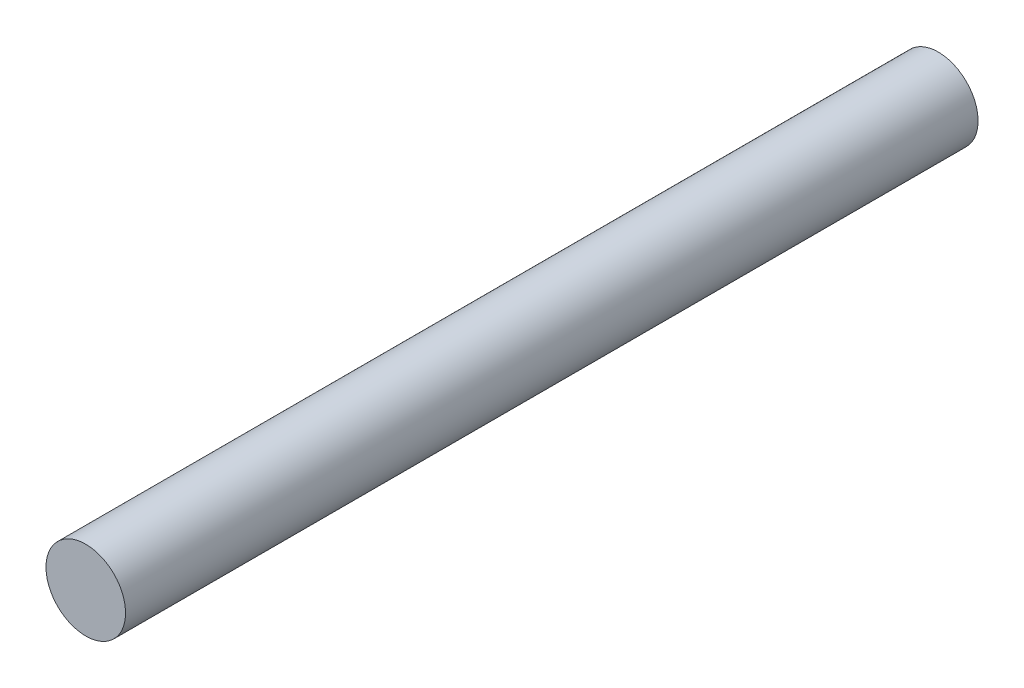
ISO-10303-21;
HEADER;
FILE_DESCRIPTION(('STEP AP214'),'2;1');
FILE_NAME('part.step','',(''),(''),'','','');
FILE_SCHEMA(('AUTOMOTIVE_DESIGN { 1 0 10303 214 1 1 1 1 }'));
ENDSEC;
DATA;
#1=APPLICATION_CONTEXT('core data for automotive mechanical design processes');
#2=APPLICATION_PROTOCOL_DEFINITION('international standard','automotive_design',2000,#1);
#3=PRODUCT_CONTEXT('',#1,'mechanical');
#4=PRODUCT('Part','Part','',(#3));
#5=PRODUCT_RELATED_PRODUCT_CATEGORY('part','',(#4));
#6=PRODUCT_DEFINITION_FORMATION('','',#4);
#7=PRODUCT_DEFINITION_CONTEXT('part definition',#1,'design');
#8=PRODUCT_DEFINITION('design','',#6,#7);
#9=PRODUCT_DEFINITION_SHAPE('','',#8);
#10=(LENGTH_UNIT() NAMED_UNIT(*) SI_UNIT(.MILLI.,.METRE.));
#11=(NAMED_UNIT(*) PLANE_ANGLE_UNIT() SI_UNIT($,.RADIAN.));
#12=(NAMED_UNIT(*) SI_UNIT($,.STERADIAN.) SOLID_ANGLE_UNIT());
#13=UNCERTAINTY_MEASURE_WITH_UNIT(LENGTH_MEASURE(1.E-05),#10,'distance_accuracy_value','');
#14=(GEOMETRIC_REPRESENTATION_CONTEXT(3) GLOBAL_UNCERTAINTY_ASSIGNED_CONTEXT((#13)) GLOBAL_UNIT_ASSIGNED_CONTEXT((#10,
#11,#12)) REPRESENTATION_CONTEXT('',''));
#15=CARTESIAN_POINT('',(0.,0.,0.));
#16=DIRECTION('',(0.,0.,1.));
#17=DIRECTION('',(1.,0.,0.));
#18=AXIS2_PLACEMENT_3D('',#15,#16,#17);
#19=CARTESIAN_POINT('',(0.,0.,38.1));
#20=DIRECTION('',(0.,0.,-1.));
#21=DIRECTION('',(-1.,0.,0.));
#22=AXIS2_PLACEMENT_3D('',#19,#20,#21);
#23=CYLINDRICAL_SURFACE('',#22,1.778);
#24=CARTESIAN_POINT('',(0.,0.,38.1));
#25=DIRECTION('',(0.,0.,1.));
#26=DIRECTION('',(1.,0.,0.));
#27=AXIS2_PLACEMENT_3D('',#24,#25,#26);
#28=CIRCLE('',#27,1.778);
#29=CARTESIAN_POINT('',(-1.778,0.,38.1));
#30=VERTEX_POINT('',#29);
#31=EDGE_CURVE('E10',#30,#30,#28,.T.);
#32=CARTESIAN_POINT('',(0.,0.,0.));
#33=DIRECTION('',(0.,0.,1.));
#34=DIRECTION('',(1.,0.,0.));
#35=AXIS2_PLACEMENT_3D('',#32,#33,#34);
#36=CIRCLE('',#35,1.778);
#37=CARTESIAN_POINT('',(-1.778,0.,0.));
#38=VERTEX_POINT('',#37);
#39=EDGE_CURVE('E46',#38,#38,#36,.T.);
#40=CARTESIAN_POINT('',(-1.778,0.,38.1));
#41=CARTESIAN_POINT('',(-1.778,0.,37.703125));
#42=CARTESIAN_POINT('',(-1.778,0.,37.30625));
#43=CARTESIAN_POINT('',(-1.778,0.,36.5125));
#44=CARTESIAN_POINT('',(-1.778,0.,36.115625));
#45=CARTESIAN_POINT('',(-1.778,0.,35.321875));
#46=CARTESIAN_POINT('',(-1.778,0.,34.925));
#47=CARTESIAN_POINT('',(-1.778,0.,34.13125));
#48=CARTESIAN_POINT('',(-1.778,0.,33.734375));
#49=CARTESIAN_POINT('',(-1.778,0.,32.940625));
#50=CARTESIAN_POINT('',(-1.778,0.,32.54375));
#51=CARTESIAN_POINT('',(-1.778,0.,31.75));
#52=CARTESIAN_POINT('',(-1.778,0.,31.353125));
#53=CARTESIAN_POINT('',(-1.778,0.,30.559375));
#54=CARTESIAN_POINT('',(-1.778,0.,30.1625));
#55=CARTESIAN_POINT('',(-1.778,0.,29.36875));
#56=CARTESIAN_POINT('',(-1.778,0.,28.971875));
#57=CARTESIAN_POINT('',(-1.778,0.,28.178125));
#58=CARTESIAN_POINT('',(-1.778,0.,27.78125));
#59=CARTESIAN_POINT('',(-1.778,0.,26.9875));
#60=CARTESIAN_POINT('',(-1.778,0.,26.590625));
#61=CARTESIAN_POINT('',(-1.778,0.,25.796875));
#62=CARTESIAN_POINT('',(-1.778,0.,25.4));
#63=CARTESIAN_POINT('',(-1.778,0.,24.60625));
#64=CARTESIAN_POINT('',(-1.778,0.,24.209375));
#65=CARTESIAN_POINT('',(-1.778,0.,23.415625));
#66=CARTESIAN_POINT('',(-1.778,0.,23.01875));
#67=CARTESIAN_POINT('',(-1.778,0.,22.225));
#68=CARTESIAN_POINT('',(-1.778,0.,21.828125));
#69=CARTESIAN_POINT('',(-1.778,0.,21.034375));
#70=CARTESIAN_POINT('',(-1.778,0.,20.6375));
#71=CARTESIAN_POINT('',(-1.778,0.,19.84375));
#72=CARTESIAN_POINT('',(-1.778,0.,19.446875));
#73=CARTESIAN_POINT('',(-1.778,0.,18.653125));
#74=CARTESIAN_POINT('',(-1.778,0.,18.25625));
#75=CARTESIAN_POINT('',(-1.778,0.,17.4625));
#76=CARTESIAN_POINT('',(-1.778,0.,17.065625));
#77=CARTESIAN_POINT('',(-1.778,0.,16.271875));
#78=CARTESIAN_POINT('',(-1.778,0.,15.875));
#79=CARTESIAN_POINT('',(-1.778,0.,15.08125));
#80=CARTESIAN_POINT('',(-1.778,0.,14.684375));
#81=CARTESIAN_POINT('',(-1.778,0.,13.890625));
#82=CARTESIAN_POINT('',(-1.778,0.,13.49375));
#83=CARTESIAN_POINT('',(-1.778,0.,12.7));
#84=CARTESIAN_POINT('',(-1.778,0.,12.303125));
#85=CARTESIAN_POINT('',(-1.778,0.,11.509375));
#86=CARTESIAN_POINT('',(-1.778,0.,11.1125));
#87=CARTESIAN_POINT('',(-1.778,0.,10.31875));
#88=CARTESIAN_POINT('',(-1.778,0.,9.92187499999999));
#89=CARTESIAN_POINT('',(-1.778,0.,9.128125));
#90=CARTESIAN_POINT('',(-1.778,0.,8.73124999999999));
#91=CARTESIAN_POINT('',(-1.778,0.,7.93749999999999));
#92=CARTESIAN_POINT('',(-1.778,0.,7.54062499999999));
#93=CARTESIAN_POINT('',(-1.778,0.,6.746875));
#94=CARTESIAN_POINT('',(-1.778,0.,6.35));
#95=CARTESIAN_POINT('',(-1.778,0.,5.55625));
#96=CARTESIAN_POINT('',(-1.778,0.,5.159375));
#97=CARTESIAN_POINT('',(-1.778,0.,4.365625));
#98=CARTESIAN_POINT('',(-1.778,0.,3.96875));
#99=CARTESIAN_POINT('',(-1.778,0.,3.175));
#100=CARTESIAN_POINT('',(-1.778,0.,2.778125));
#101=CARTESIAN_POINT('',(-1.778,0.,1.984375));
#102=CARTESIAN_POINT('',(-1.778,0.,1.5875));
#103=CARTESIAN_POINT('',(-1.778,0.,0.79375));
#104=CARTESIAN_POINT('',(-1.778,0.,0.396875));
#105=CARTESIAN_POINT('',(-1.778,0.,0.));
#106=B_SPLINE_CURVE_WITH_KNOTS('',3,(#40,#41,#42,#43,#44,#45,#46,#47,#48,#49,#50,#51,#52,#53,
#54,#55,#56,#57,#58,#59,#60,#61,#62,#63,#64,#65,#66,#67,#68,#69,#70,#71,#72,#73,#74,#75,#76,#77,
#78,#79,#80,#81,#82,#83,#84,#85,#86,#87,#88,#89,#90,#91,#92,#93,#94,#95,#96,#97,#98,#99,#100,
#101,#102,#103,#104,#105),.UNSPECIFIED.,.F.,.F.,(4,2,2,2,2,2,2,2,2,2,2,2,2,2,2,2,2,2,2,2,2,2,2,
2,2,2,2,2,2,2,2,2,4),(0.,1.190625,2.38125,3.571875,4.7625,5.953125,7.14375,8.334375,
9.52500000000001,10.715625,11.90625,13.096875,14.2875,15.478125,16.66875,17.859375,19.05,
20.240625,21.43125,22.621875,23.8125,25.003125,26.19375,27.384375,28.575,29.765625,30.95625,
32.146875,33.3375,34.528125,35.71875,36.909375,38.1),.UNSPECIFIED.);
#107=EDGE_CURVE('BSEAM43',#30,#38,#106,.T.);
#108=ORIENTED_EDGE('',*,*,#31,.F.);
#109=ORIENTED_EDGE('',*,*,#39,.T.);
#110=ORIENTED_EDGE('',*,*,#107,.T.);
#111=ORIENTED_EDGE('',*,*,#107,.F.);
#112=EDGE_LOOP('',(#108,#110,#109,#111));
#113=FACE_BOUND('',#112,.T.);
#114=ADVANCED_FACE('F43',(#113),#23,.T.);
#115=CARTESIAN_POINT('',(0.,0.,38.1));
#116=DIRECTION('',(0.,0.,1.));
#117=DIRECTION('',(1.,0.,0.));
#118=AXIS2_PLACEMENT_3D('',#115,#116,#117);
#119=PLANE('',#118);
#120=ORIENTED_EDGE('',*,*,#31,.T.);
#121=EDGE_LOOP('',(#120));
#122=FACE_BOUND('',#121,.T.);
#123=ADVANCED_FACE('F58',(#122),#119,.T.);
#124=CARTESIAN_POINT('',(0.,0.,0.));
#125=DIRECTION('',(0.,0.,1.));
#126=DIRECTION('',(1.,0.,0.));
#127=AXIS2_PLACEMENT_3D('',#124,#125,#126);
#128=PLANE('',#127);
#129=ORIENTED_EDGE('',*,*,#39,.F.);
#130=EDGE_LOOP('',(#129));
#131=FACE_BOUND('',#130,.T.);
#132=ADVANCED_FACE('F59',(#131),#128,.F.);
#133=CLOSED_SHELL('',(#114,#123,#132));
#134=MANIFOLD_SOLID_BREP('B2',#133);
#135=ADVANCED_BREP_SHAPE_REPRESENTATION('',(#18,#134),#14);
#136=SHAPE_DEFINITION_REPRESENTATION(#9,#135);
ENDSEC;
END-ISO-10303-21;
